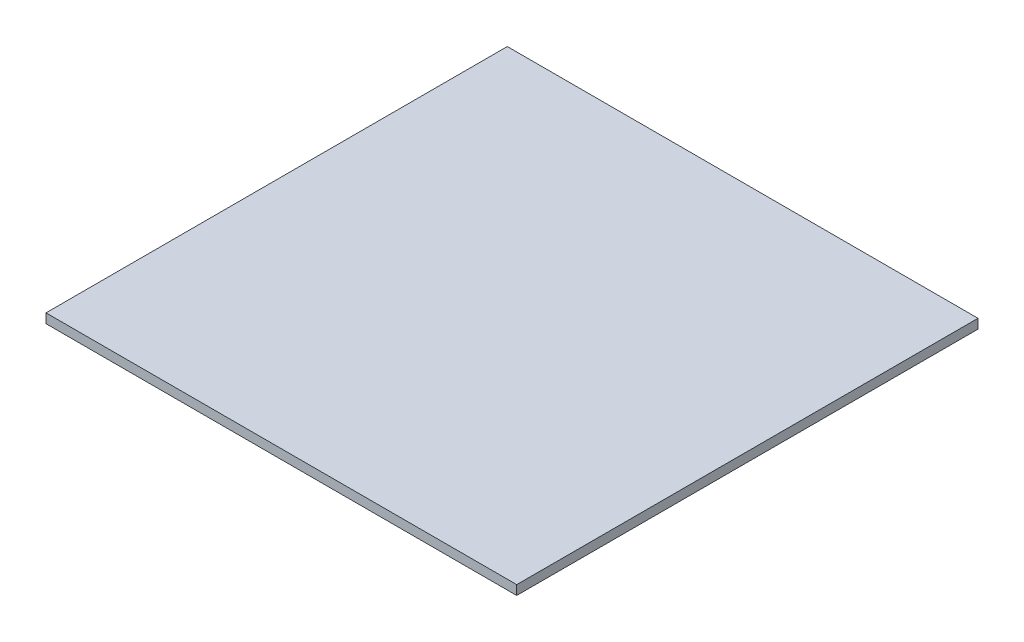
ISO-10303-21;
HEADER;
FILE_DESCRIPTION(('STEP AP214'),'2;1');
FILE_NAME('part.step','',(''),(''),'','','');
FILE_SCHEMA(('AUTOMOTIVE_DESIGN { 1 0 10303 214 1 1 1 1 }'));
ENDSEC;
DATA;
#1=APPLICATION_CONTEXT('core data for automotive mechanical design processes');
#2=APPLICATION_PROTOCOL_DEFINITION('international standard','automotive_design',2000,#1);
#3=PRODUCT_CONTEXT('',#1,'mechanical');
#4=PRODUCT('Part','Part','',(#3));
#5=PRODUCT_RELATED_PRODUCT_CATEGORY('part','',(#4));
#6=PRODUCT_DEFINITION_FORMATION('','',#4);
#7=PRODUCT_DEFINITION_CONTEXT('part definition',#1,'design');
#8=PRODUCT_DEFINITION('design','',#6,#7);
#9=PRODUCT_DEFINITION_SHAPE('','',#8);
#10=(LENGTH_UNIT() NAMED_UNIT(*) SI_UNIT(.MILLI.,.METRE.));
#11=(NAMED_UNIT(*) PLANE_ANGLE_UNIT() SI_UNIT($,.RADIAN.));
#12=(NAMED_UNIT(*) SI_UNIT($,.STERADIAN.) SOLID_ANGLE_UNIT());
#13=UNCERTAINTY_MEASURE_WITH_UNIT(LENGTH_MEASURE(1.E-05),#10,'distance_accuracy_value','');
#14=(GEOMETRIC_REPRESENTATION_CONTEXT(3) GLOBAL_UNCERTAINTY_ASSIGNED_CONTEXT((#13)) GLOBAL_UNIT_ASSIGNED_CONTEXT((#10,
#11,#12)) REPRESENTATION_CONTEXT('',''));
#15=CARTESIAN_POINT('',(0.,0.,0.));
#16=DIRECTION('',(0.,0.,1.));
#17=DIRECTION('',(1.,0.,0.));
#18=AXIS2_PLACEMENT_3D('',#15,#16,#17);
#19=CARTESIAN_POINT('',(317.5,12.7,311.15));
#20=DIRECTION('',(-1.,0.,0.));
#21=DIRECTION('',(0.,0.,1.));
#22=AXIS2_PLACEMENT_3D('',#19,#20,#21);
#23=PLANE('',#22);
#24=DIRECTION('',(0.,0.,-1.));
#25=VECTOR('',#24,1.);
#26=CARTESIAN_POINT('',(317.5,0.,311.15));
#27=LINE('',#26,#25);
#28=CARTESIAN_POINT('',(317.5,0.,311.15));
#29=VERTEX_POINT('',#28);
#30=CARTESIAN_POINT('',(317.5,0.,-311.15));
#31=VERTEX_POINT('',#30);
#32=EDGE_CURVE('E96',#29,#31,#27,.T.);
#33=ORIENTED_EDGE('',*,*,#32,.T.);
#34=DIRECTION('',(0.,-1.,0.));
#35=VECTOR('',#34,1.);
#36=CARTESIAN_POINT('',(317.5,12.7,-311.15));
#37=LINE('',#36,#35);
#38=CARTESIAN_POINT('',(317.5,12.7,-311.15));
#39=VERTEX_POINT('',#38);
#40=EDGE_CURVE('E11',#39,#31,#37,.T.);
#41=ORIENTED_EDGE('',*,*,#40,.F.);
#42=DIRECTION('',(0.,0.,-1.));
#43=VECTOR('',#42,1.);
#44=CARTESIAN_POINT('',(317.5,12.7,311.15));
#45=LINE('',#44,#43);
#46=CARTESIAN_POINT('',(317.5,12.7,311.15));
#47=VERTEX_POINT('',#46);
#48=EDGE_CURVE('E84',#47,#39,#45,.T.);
#49=ORIENTED_EDGE('',*,*,#48,.F.);
#50=DIRECTION('',(0.,-1.,0.));
#51=VECTOR('',#50,1.);
#52=CARTESIAN_POINT('',(317.5,12.7,311.15));
#53=LINE('',#52,#51);
#54=EDGE_CURVE('E92',#47,#29,#53,.T.);
#55=ORIENTED_EDGE('',*,*,#54,.T.);
#56=EDGE_LOOP('',(#33,#41,#49,#55));
#57=FACE_BOUND('',#56,.T.);
#58=ADVANCED_FACE('F33',(#57),#23,.F.);
#59=CARTESIAN_POINT('',(-317.5,12.7,-311.15));
#60=DIRECTION('',(0.,0.,1.));
#61=DIRECTION('',(1.,0.,0.));
#62=AXIS2_PLACEMENT_3D('',#59,#60,#61);
#63=PLANE('',#62);
#64=DIRECTION('',(-1.,0.,0.));
#65=VECTOR('',#64,1.);
#66=CARTESIAN_POINT('',(-317.5,0.,-311.15));
#67=LINE('',#66,#65);
#68=CARTESIAN_POINT('',(-317.5,0.,-311.15));
#69=VERTEX_POINT('',#68);
#70=EDGE_CURVE('E88',#31,#69,#67,.T.);
#71=ORIENTED_EDGE('',*,*,#70,.T.);
#72=DIRECTION('',(0.,-1.,0.));
#73=VECTOR('',#72,1.);
#74=CARTESIAN_POINT('',(-317.5,12.7,-311.15));
#75=LINE('',#74,#73);
#76=CARTESIAN_POINT('',(-317.5,12.7,-311.15));
#77=VERTEX_POINT('',#76);
#78=EDGE_CURVE('E41',#77,#69,#75,.T.);
#79=ORIENTED_EDGE('',*,*,#78,.F.);
#80=DIRECTION('',(-1.,0.,0.));
#81=VECTOR('',#80,1.);
#82=CARTESIAN_POINT('',(-317.5,12.7,-311.15));
#83=LINE('',#82,#81);
#84=EDGE_CURVE('E79',#39,#77,#83,.T.);
#85=ORIENTED_EDGE('',*,*,#84,.F.);
#86=ORIENTED_EDGE('',*,*,#40,.T.);
#87=EDGE_LOOP('',(#71,#79,#85,#86));
#88=FACE_BOUND('',#87,.T.);
#89=ADVANCED_FACE('F87',(#88),#63,.F.);
#90=CARTESIAN_POINT('',(-317.5,12.7,311.15));
#91=DIRECTION('',(1.,0.,0.));
#92=DIRECTION('',(0.,0.,-1.));
#93=AXIS2_PLACEMENT_3D('',#90,#91,#92);
#94=PLANE('',#93);
#95=DIRECTION('',(0.,0.,1.));
#96=VECTOR('',#95,1.);
#97=CARTESIAN_POINT('',(-317.5,0.,311.15));
#98=LINE('',#97,#96);
#99=CARTESIAN_POINT('',(-317.5,0.,311.15));
#100=VERTEX_POINT('',#99);
#101=EDGE_CURVE('E66',#69,#100,#98,.T.);
#102=ORIENTED_EDGE('',*,*,#101,.T.);
#103=DIRECTION('',(0.,-1.,0.));
#104=VECTOR('',#103,1.);
#105=CARTESIAN_POINT('',(-317.5,12.7,311.15));
#106=LINE('',#105,#104);
#107=CARTESIAN_POINT('',(-317.5,12.7,311.15));
#108=VERTEX_POINT('',#107);
#109=EDGE_CURVE('E89',#108,#100,#106,.T.);
#110=ORIENTED_EDGE('',*,*,#109,.F.);
#111=DIRECTION('',(0.,0.,1.));
#112=VECTOR('',#111,1.);
#113=CARTESIAN_POINT('',(-317.5,12.7,311.15));
#114=LINE('',#113,#112);
#115=EDGE_CURVE('E82',#77,#108,#114,.T.);
#116=ORIENTED_EDGE('',*,*,#115,.F.);
#117=ORIENTED_EDGE('',*,*,#78,.T.);
#118=EDGE_LOOP('',(#102,#110,#116,#117));
#119=FACE_BOUND('',#118,.T.);
#120=ADVANCED_FACE('F90',(#119),#94,.F.);
#121=CARTESIAN_POINT('',(-317.5,12.7,311.15));
#122=DIRECTION('',(0.,0.,-1.));
#123=DIRECTION('',(-1.,0.,0.));
#124=AXIS2_PLACEMENT_3D('',#121,#122,#123);
#125=PLANE('',#124);
#126=DIRECTION('',(1.,0.,0.));
#127=VECTOR('',#126,1.);
#128=CARTESIAN_POINT('',(-317.5,0.,311.15));
#129=LINE('',#128,#127);
#130=EDGE_CURVE('E72',#100,#29,#129,.T.);
#131=ORIENTED_EDGE('',*,*,#130,.T.);
#132=ORIENTED_EDGE('',*,*,#54,.F.);
#133=DIRECTION('',(1.,0.,0.));
#134=VECTOR('',#133,1.);
#135=CARTESIAN_POINT('',(-317.5,12.7,311.15));
#136=LINE('',#135,#134);
#137=EDGE_CURVE('E49',#108,#47,#136,.T.);
#138=ORIENTED_EDGE('',*,*,#137,.F.);
#139=ORIENTED_EDGE('',*,*,#109,.T.);
#140=EDGE_LOOP('',(#131,#132,#138,#139));
#141=FACE_BOUND('',#140,.T.);
#142=ADVANCED_FACE('F103',(#141),#125,.F.);
#143=CARTESIAN_POINT('',(0.,12.7,0.));
#144=DIRECTION('',(0.,-1.,0.));
#145=DIRECTION('',(0.,0.,-1.));
#146=AXIS2_PLACEMENT_3D('',#143,#144,#145);
#147=PLANE('',#146);
#148=ORIENTED_EDGE('',*,*,#48,.T.);
#149=ORIENTED_EDGE('',*,*,#84,.T.);
#150=ORIENTED_EDGE('',*,*,#115,.T.);
#151=ORIENTED_EDGE('',*,*,#137,.T.);
#152=EDGE_LOOP('',(#148,#149,#150,#151));
#153=FACE_BOUND('',#152,.T.);
#154=ADVANCED_FACE('F80',(#153),#147,.F.);
#155=CARTESIAN_POINT('',(0.,0.,0.));
#156=DIRECTION('',(0.,-1.,0.));
#157=DIRECTION('',(0.,0.,-1.));
#158=AXIS2_PLACEMENT_3D('',#155,#156,#157);
#159=PLANE('',#158);
#160=ORIENTED_EDGE('',*,*,#32,.F.);
#161=ORIENTED_EDGE('',*,*,#130,.F.);
#162=ORIENTED_EDGE('',*,*,#101,.F.);
#163=ORIENTED_EDGE('',*,*,#70,.F.);
#164=EDGE_LOOP('',(#160,#161,#162,#163));
#165=FACE_BOUND('',#164,.T.);
#166=ADVANCED_FACE('F106',(#165),#159,.T.);
#167=CLOSED_SHELL('',(#58,#89,#120,#142,#154,#166));
#168=MANIFOLD_SOLID_BREP('B2',#167);
#169=ADVANCED_BREP_SHAPE_REPRESENTATION('',(#18,#168),#14);
#170=SHAPE_DEFINITION_REPRESENTATION(#9,#169);
ENDSEC;
END-ISO-10303-21;
